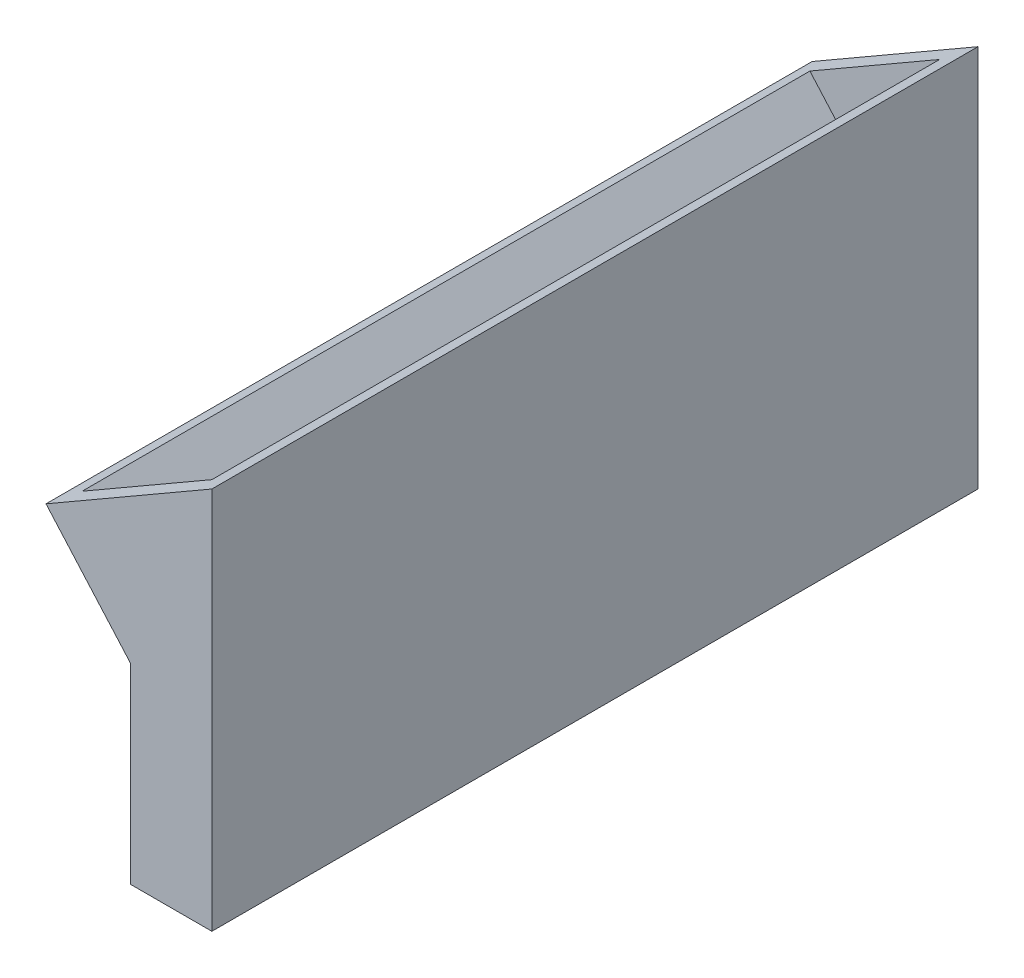
ISO-10303-21;
HEADER;
FILE_DESCRIPTION(('STEP AP214'),'2;1');
FILE_NAME('part.step','',(''),(''),'','','');
FILE_SCHEMA(('AUTOMOTIVE_DESIGN { 1 0 10303 214 1 1 1 1 }'));
ENDSEC;
DATA;
#1=APPLICATION_CONTEXT('core data for automotive mechanical design processes');
#2=APPLICATION_PROTOCOL_DEFINITION('international standard','automotive_design',2000,#1);
#3=PRODUCT_CONTEXT('',#1,'mechanical');
#4=PRODUCT('Part','Part','',(#3));
#5=PRODUCT_RELATED_PRODUCT_CATEGORY('part','',(#4));
#6=PRODUCT_DEFINITION_FORMATION('','',#4);
#7=PRODUCT_DEFINITION_CONTEXT('part definition',#1,'design');
#8=PRODUCT_DEFINITION('design','',#6,#7);
#9=PRODUCT_DEFINITION_SHAPE('','',#8);
#10=(LENGTH_UNIT() NAMED_UNIT(*) SI_UNIT(.MILLI.,.METRE.));
#11=(NAMED_UNIT(*) PLANE_ANGLE_UNIT() SI_UNIT($,.RADIAN.));
#12=(NAMED_UNIT(*) SI_UNIT($,.STERADIAN.) SOLID_ANGLE_UNIT());
#13=UNCERTAINTY_MEASURE_WITH_UNIT(LENGTH_MEASURE(1.E-05),#10,'distance_accuracy_value','');
#14=(GEOMETRIC_REPRESENTATION_CONTEXT(3) GLOBAL_UNCERTAINTY_ASSIGNED_CONTEXT((#13)) GLOBAL_UNIT_ASSIGNED_CONTEXT((#10,
#11,#12)) REPRESENTATION_CONTEXT('',''));
#15=CARTESIAN_POINT('',(0.,0.,0.));
#16=DIRECTION('',(0.,0.,1.));
#17=DIRECTION('',(1.,0.,0.));
#18=AXIS2_PLACEMENT_3D('',#15,#16,#17);
#19=CARTESIAN_POINT('',(-127.5200555821,0.,600.));
#20=DIRECTION('',(0.,1.,0.));
#21=DIRECTION('',(0.,0.,1.));
#22=AXIS2_PLACEMENT_3D('',#19,#20,#21);
#23=PLANE('',#22);
#24=DIRECTION('',(0.,0.,-1.));
#25=VECTOR('',#24,1.);
#26=CARTESIAN_POINT('',(-30.0000000000002,0.,-570.));
#27=LINE('',#26,#25);
#28=CARTESIAN_POINT('',(-30.,0.,570.));
#29=VERTEX_POINT('',#28);
#30=CARTESIAN_POINT('',(-30.,0.,476.30683123147));
#31=VERTEX_POINT('',#30);
#32=EDGE_CURVE('E241',#29,#31,#27,.T.);
#33=ORIENTED_EDGE('',*,*,#32,.T.);
#34=DIRECTION('',(-1.,0.,0.));
#35=VECTOR('',#34,1.);
#36=CARTESIAN_POINT('',(-127.5200555821,0.,476.30683123147));
#37=LINE('',#36,#35);
#38=CARTESIAN_POINT('',(-97.5200555820998,0.,476.30683123147));
#39=VERTEX_POINT('',#38);
#40=EDGE_CURVE('E226',#31,#39,#37,.T.);
#41=ORIENTED_EDGE('',*,*,#40,.T.);
#42=DIRECTION('',(0.,0.,1.));
#43=VECTOR('',#42,1.);
#44=CARTESIAN_POINT('',(-97.5200555820998,0.,-570.));
#45=LINE('',#44,#43);
#46=CARTESIAN_POINT('',(-97.5200555820996,0.,570.));
#47=VERTEX_POINT('',#46);
#48=EDGE_CURVE('E170',#39,#47,#45,.T.);
#49=ORIENTED_EDGE('',*,*,#48,.T.);
#50=DIRECTION('',(1.,0.,0.));
#51=VECTOR('',#50,1.);
#52=CARTESIAN_POINT('',(-97.5200555820996,0.,570.));
#53=LINE('',#52,#51);
#54=EDGE_CURVE('E236',#47,#29,#53,.T.);
#55=ORIENTED_EDGE('',*,*,#54,.T.);
#56=EDGE_LOOP('',(#33,#41,#49,#55));
#57=FACE_BOUND('',#56,.T.);
#58=ADVANCED_FACE('F45',(#57),#23,.T.);
#59=CARTESIAN_POINT('',(-97.5200555820998,0.,-570.));
#60=VERTEX_POINT('',#59);
#61=CARTESIAN_POINT('',(-97.5200555820998,0.,-476.30683123147));
#62=VERTEX_POINT('',#61);
#63=EDGE_CURVE('E232',#60,#62,#45,.T.);
#64=ORIENTED_EDGE('',*,*,#63,.T.);
#65=DIRECTION('',(1.,0.,0.));
#66=VECTOR('',#65,1.);
#67=CARTESIAN_POINT('',(-127.5200555821,0.,-476.30683123147));
#68=LINE('',#67,#66);
#69=CARTESIAN_POINT('',(-30.,0.,-476.30683123147));
#70=VERTEX_POINT('',#69);
#71=EDGE_CURVE('E220',#62,#70,#68,.T.);
#72=ORIENTED_EDGE('',*,*,#71,.T.);
#73=CARTESIAN_POINT('',(-30.0000000000002,0.,-570.));
#74=VERTEX_POINT('',#73);
#75=EDGE_CURVE('E240',#70,#74,#27,.T.);
#76=ORIENTED_EDGE('',*,*,#75,.T.);
#77=DIRECTION('',(-1.,0.,0.));
#78=VECTOR('',#77,1.);
#79=CARTESIAN_POINT('',(-97.5200555820998,0.,-570.));
#80=LINE('',#79,#78);
#81=EDGE_CURVE('E245',#74,#60,#80,.T.);
#82=ORIENTED_EDGE('',*,*,#81,.T.);
#83=EDGE_LOOP('',(#64,#72,#76,#82));
#84=FACE_BOUND('',#83,.T.);
#85=ADVANCED_FACE('F363',(#84),#23,.T.);
#86=CARTESIAN_POINT('',(0.,500.,600.));
#87=DIRECTION('',(0.500000000000004,-0.866025403784436,0.));
#88=DIRECTION('',(0.866025403784436,0.500000000000004,0.));
#89=AXIS2_PLACEMENT_3D('',#86,#87,#88);
#90=PLANE('',#89);
#91=DIRECTION('',(-0.866025403784436,-0.500000000000004,0.));
#92=VECTOR('',#91,1.);
#93=CARTESIAN_POINT('',(0.,500.,-600.));
#94=LINE('',#93,#92);
#95=CARTESIAN_POINT('',(0.,500.,-600.));
#96=VERTEX_POINT('',#95);
#97=CARTESIAN_POINT('',(-259.807621135331,349.999999999999,-600.));
#98=VERTEX_POINT('',#97);
#99=EDGE_CURVE('E301',#96,#98,#94,.T.);
#100=ORIENTED_EDGE('',*,*,#99,.T.);
#101=DIRECTION('',(0.,0.,-1.));
#102=VECTOR('',#101,1.);
#103=CARTESIAN_POINT('',(-259.807621135331,349.999999999999,600.));
#104=LINE('',#103,#102);
#105=CARTESIAN_POINT('',(-259.807621135331,349.999999999999,600.));
#106=VERTEX_POINT('',#105);
#107=EDGE_CURVE('E308',#106,#98,#104,.T.);
#108=ORIENTED_EDGE('',*,*,#107,.F.);
#109=DIRECTION('',(-0.866025403784436,-0.500000000000004,0.));
#110=VECTOR('',#109,1.);
#111=CARTESIAN_POINT('',(0.,500.,600.));
#112=LINE('',#111,#110);
#113=CARTESIAN_POINT('',(0.,500.,600.));
#114=VERTEX_POINT('',#113);
#115=EDGE_CURVE('E290',#114,#106,#112,.T.);
#116=ORIENTED_EDGE('',*,*,#115,.F.);
#117=DIRECTION('',(0.,0.,-1.));
#118=VECTOR('',#117,1.);
#119=CARTESIAN_POINT('',(0.,500.,600.));
#120=LINE('',#119,#118);
#121=EDGE_CURVE('E312',#114,#96,#120,.T.);
#122=ORIENTED_EDGE('',*,*,#121,.T.);
#123=EDGE_LOOP('',(#100,#108,#116,#122));
#124=FACE_BOUND('',#123,.T.);
#125=DIRECTION('',(-0.866025403784436,-0.500000000000004,0.));
#126=VECTOR('',#125,1.);
#127=CARTESIAN_POINT('',(0.,500.,-570.));
#128=LINE('',#127,#126);
#129=CARTESIAN_POINT('',(-30.,482.679491924311,-570.));
#130=VERTEX_POINT('',#129);
#131=CARTESIAN_POINT('',(-233.303075305066,365.302406669851,-570.));
#132=VERTEX_POINT('',#131);
#133=EDGE_CURVE('E252',#130,#132,#128,.T.);
#134=ORIENTED_EDGE('',*,*,#133,.F.);
#135=DIRECTION('',(0.,0.,-1.));
#136=VECTOR('',#135,1.);
#137=CARTESIAN_POINT('',(-30.,482.679491924311,600.));
#138=LINE('',#137,#136);
#139=CARTESIAN_POINT('',(-30.,482.679491924311,570.));
#140=VERTEX_POINT('',#139);
#141=EDGE_CURVE('E276',#140,#130,#138,.T.);
#142=ORIENTED_EDGE('',*,*,#141,.F.);
#143=DIRECTION('',(-0.866025403784436,-0.500000000000004,0.));
#144=VECTOR('',#143,1.);
#145=CARTESIAN_POINT('',(0.,500.,570.));
#146=LINE('',#145,#144);
#147=CARTESIAN_POINT('',(-233.303075305066,365.302406669851,570.));
#148=VERTEX_POINT('',#147);
#149=EDGE_CURVE('E257',#140,#148,#146,.T.);
#150=ORIENTED_EDGE('',*,*,#149,.T.);
#151=DIRECTION('',(0.,0.,-1.));
#152=VECTOR('',#151,1.);
#153=CARTESIAN_POINT('',(-233.303075305066,365.302406669851,600.));
#154=LINE('',#153,#152);
#155=EDGE_CURVE('E273',#148,#132,#154,.T.);
#156=ORIENTED_EDGE('',*,*,#155,.T.);
#157=EDGE_LOOP('',(#134,#142,#150,#156));
#158=FACE_BOUND('',#157,.T.);
#159=ADVANCED_FACE('F372',(#124,#158),#90,.F.);
#160=CARTESIAN_POINT('',(0.,0.,600.));
#161=DIRECTION('',(-1.,0.,0.));
#162=DIRECTION('',(0.,0.,1.));
#163=AXIS2_PLACEMENT_3D('',#160,#161,#162);
#164=PLANE('',#163);
#165=DIRECTION('',(0.,1.,0.));
#166=VECTOR('',#165,1.);
#167=CARTESIAN_POINT('',(0.,0.,-600.));
#168=LINE('',#167,#166);
#169=CARTESIAN_POINT('',(0.,-100.,-600.));
#170=VERTEX_POINT('',#169);
#171=EDGE_CURVE('E188',#170,#96,#168,.T.);
#172=ORIENTED_EDGE('',*,*,#171,.T.);
#173=ORIENTED_EDGE('',*,*,#121,.F.);
#174=DIRECTION('',(0.,1.,0.));
#175=VECTOR('',#174,1.);
#176=CARTESIAN_POINT('',(0.,0.,600.));
#177=LINE('',#176,#175);
#178=CARTESIAN_POINT('',(0.,-100.,600.));
#179=VERTEX_POINT('',#178);
#180=EDGE_CURVE('E182',#179,#114,#177,.T.);
#181=ORIENTED_EDGE('',*,*,#180,.F.);
#182=DIRECTION('',(0.,0.,-1.));
#183=VECTOR('',#182,1.);
#184=CARTESIAN_POINT('',(0.,-100.,-200.));
#185=LINE('',#184,#183);
#186=EDGE_CURVE('E171',#179,#170,#185,.T.);
#187=ORIENTED_EDGE('',*,*,#186,.T.);
#188=EDGE_LOOP('',(#172,#173,#181,#187));
#189=FACE_BOUND('',#188,.T.);
#190=ADVANCED_FACE('F374',(#189),#164,.F.);
#191=CARTESIAN_POINT('',(-259.807621135331,349.999999999999,600.));
#192=DIRECTION('',(0.749999999999993,0.661437827766155,0.));
#193=DIRECTION('',(-0.661437827766155,0.749999999999993,0.));
#194=AXIS2_PLACEMENT_3D('',#191,#192,#193);
#195=PLANE('',#194);
#196=DIRECTION('',(0.661437827766155,-0.749999999999993,0.));
#197=VECTOR('',#196,1.);
#198=CARTESIAN_POINT('',(-259.807621135331,349.999999999999,-600.));
#199=LINE('',#198,#197);
#200=CARTESIAN_POINT('',(-127.5200555821,200.,-600.));
#201=VERTEX_POINT('',#200);
#202=EDGE_CURVE('E183',#98,#201,#199,.T.);
#203=ORIENTED_EDGE('',*,*,#202,.T.);
#204=DIRECTION('',(0.,0.,-1.));
#205=VECTOR('',#204,1.);
#206=CARTESIAN_POINT('',(-127.5200555821,200.,600.));
#207=LINE('',#206,#205);
#208=CARTESIAN_POINT('',(-127.5200555821,200.,600.));
#209=VERTEX_POINT('',#208);
#210=EDGE_CURVE('E178',#209,#201,#207,.T.);
#211=ORIENTED_EDGE('',*,*,#210,.F.);
#212=DIRECTION('',(0.661437827766155,-0.749999999999993,0.));
#213=VECTOR('',#212,1.);
#214=CARTESIAN_POINT('',(-259.807621135331,349.999999999999,600.));
#215=LINE('',#214,#213);
#216=EDGE_CURVE('E293',#106,#209,#215,.T.);
#217=ORIENTED_EDGE('',*,*,#216,.F.);
#218=ORIENTED_EDGE('',*,*,#107,.T.);
#219=EDGE_LOOP('',(#203,#211,#217,#218));
#220=FACE_BOUND('',#219,.T.);
#221=ADVANCED_FACE('F381',(#220),#195,.F.);
#222=CARTESIAN_POINT('',(-127.5200555821,200.,600.));
#223=DIRECTION('',(1.,0.,0.));
#224=DIRECTION('',(0.,1.,0.));
#225=AXIS2_PLACEMENT_3D('',#222,#223,#224);
#226=PLANE('',#225);
#227=DIRECTION('',(0.,-1.,0.));
#228=VECTOR('',#227,1.);
#229=CARTESIAN_POINT('',(-127.5200555821,200.,-600.));
#230=LINE('',#229,#228);
#231=CARTESIAN_POINT('',(-127.5200555821,-100.,-600.));
#232=VERTEX_POINT('',#231);
#233=EDGE_CURVE('E175',#201,#232,#230,.T.);
#234=ORIENTED_EDGE('',*,*,#233,.T.);
#235=DIRECTION('',(0.,0.,-1.));
#236=VECTOR('',#235,1.);
#237=CARTESIAN_POINT('',(-127.5200555821,-100.,-200.));
#238=LINE('',#237,#236);
#239=CARTESIAN_POINT('',(-127.5200555821,-100.,600.));
#240=VERTEX_POINT('',#239);
#241=EDGE_CURVE('E159',#240,#232,#238,.T.);
#242=ORIENTED_EDGE('',*,*,#241,.F.);
#243=DIRECTION('',(0.,-1.,0.));
#244=VECTOR('',#243,1.);
#245=CARTESIAN_POINT('',(-127.5200555821,200.,600.));
#246=LINE('',#245,#244);
#247=EDGE_CURVE('E296',#209,#240,#246,.T.);
#248=ORIENTED_EDGE('',*,*,#247,.F.);
#249=ORIENTED_EDGE('',*,*,#210,.T.);
#250=EDGE_LOOP('',(#234,#242,#248,#249));
#251=FACE_BOUND('',#250,.T.);
#252=ADVANCED_FACE('F176',(#251),#226,.F.);
#253=CARTESIAN_POINT('',(0.,0.,600.));
#254=DIRECTION('',(0.,0.,1.));
#255=DIRECTION('',(1.,0.,0.));
#256=AXIS2_PLACEMENT_3D('',#253,#254,#255);
#257=PLANE('',#256);
#258=ORIENTED_EDGE('',*,*,#247,.T.);
#259=DIRECTION('',(1.,0.,0.));
#260=VECTOR('',#259,1.);
#261=CARTESIAN_POINT('',(-539.830618143866,-100.,600.));
#262=LINE('',#261,#260);
#263=EDGE_CURVE('E166',#240,#179,#262,.T.);
#264=ORIENTED_EDGE('',*,*,#263,.T.);
#265=ORIENTED_EDGE('',*,*,#180,.T.);
#266=ORIENTED_EDGE('',*,*,#115,.T.);
#267=ORIENTED_EDGE('',*,*,#216,.T.);
#268=EDGE_LOOP('',(#258,#264,#265,#266,#267));
#269=FACE_BOUND('',#268,.T.);
#270=ADVANCED_FACE('F404',(#269),#257,.T.);
#271=CARTESIAN_POINT('',(0.,0.,-600.));
#272=DIRECTION('',(0.,0.,1.));
#273=DIRECTION('',(1.,0.,0.));
#274=AXIS2_PLACEMENT_3D('',#271,#272,#273);
#275=PLANE('',#274);
#276=ORIENTED_EDGE('',*,*,#171,.F.);
#277=DIRECTION('',(1.,0.,0.));
#278=VECTOR('',#277,1.);
#279=CARTESIAN_POINT('',(-539.830618143866,-100.,-600.));
#280=LINE('',#279,#278);
#281=EDGE_CURVE('E164',#232,#170,#280,.T.);
#282=ORIENTED_EDGE('',*,*,#281,.F.);
#283=ORIENTED_EDGE('',*,*,#233,.F.);
#284=ORIENTED_EDGE('',*,*,#202,.F.);
#285=ORIENTED_EDGE('',*,*,#99,.F.);
#286=EDGE_LOOP('',(#276,#282,#283,#284,#285));
#287=FACE_BOUND('',#286,.T.);
#288=ADVANCED_FACE('F186',(#287),#275,.F.);
#289=CARTESIAN_POINT('',(-30.,0.,600.));
#290=DIRECTION('',(-1.,0.,0.));
#291=DIRECTION('',(0.,0.,1.));
#292=AXIS2_PLACEMENT_3D('',#289,#290,#291);
#293=PLANE('',#292);
#294=DIRECTION('',(0.,1.,0.));
#295=VECTOR('',#294,1.);
#296=CARTESIAN_POINT('',(-30.,0.,-570.));
#297=LINE('',#296,#295);
#298=EDGE_CURVE('E249',#74,#130,#297,.T.);
#299=ORIENTED_EDGE('',*,*,#298,.F.);
#300=ORIENTED_EDGE('',*,*,#75,.F.);
#301=DIRECTION('',(0.,0.242535625036333,-0.970142500145332));
#302=VECTOR('',#301,1.);
#303=CARTESIAN_POINT('',(-30.,29.10427500436,-592.72393124891));
#304=LINE('',#303,#302);
#305=CARTESIAN_POINT('',(-30.,-62.4301301277304,-226.586310720548));
#306=VERTEX_POINT('',#305);
#307=EDGE_CURVE('E213',#306,#70,#304,.T.);
#308=ORIENTED_EDGE('',*,*,#307,.F.);
#309=CARTESIAN_POINT('',(-30.,-101.235830133544,-236.287735722002));
#310=DIRECTION('',(-1.,0.,0.));
#311=DIRECTION('',(0.,0.,1.));
#312=AXIS2_PLACEMENT_3D('',#309,#310,#311);
#313=CIRCLE('',#312,40.);
#314=CARTESIAN_POINT('',(-30.,-100.,-196.30683123147));
#315=VERTEX_POINT('',#314);
#316=EDGE_CURVE('E322',#306,#315,#313,.F.);
#317=ORIENTED_EDGE('',*,*,#316,.T.);
#318=DIRECTION('',(0.,0.,-1.));
#319=VECTOR('',#318,1.);
#320=CARTESIAN_POINT('',(-30.,-100.,-196.30683123147));
#321=LINE('',#320,#319);
#322=CARTESIAN_POINT('',(-30.,-100.,196.30683123147));
#323=VERTEX_POINT('',#322);
#324=EDGE_CURVE('E192',#323,#315,#321,.T.);
#325=ORIENTED_EDGE('',*,*,#324,.F.);
#326=CARTESIAN_POINT('',(-30.,-101.235830133544,236.287735722002));
#327=DIRECTION('',(-1.,0.,0.));
#328=DIRECTION('',(0.,0.,1.));
#329=AXIS2_PLACEMENT_3D('',#326,#327,#328);
#330=CIRCLE('',#329,40.);
#331=CARTESIAN_POINT('',(-30.,-62.4301301277304,226.586310720549));
#332=VERTEX_POINT('',#331);
#333=EDGE_CURVE('E54',#323,#332,#330,.F.);
#334=ORIENTED_EDGE('',*,*,#333,.T.);
#335=DIRECTION('',(0.,-0.242535625036333,-0.970142500145332));
#336=VECTOR('',#335,1.);
#337=CARTESIAN_POINT('',(-30.,-70.8957249956401,192.72393124891));
#338=LINE('',#337,#336);
#339=EDGE_CURVE('E210',#31,#332,#338,.T.);
#340=ORIENTED_EDGE('',*,*,#339,.F.);
#341=ORIENTED_EDGE('',*,*,#32,.F.);
#342=DIRECTION('',(0.,1.,0.));
#343=VECTOR('',#342,1.);
#344=CARTESIAN_POINT('',(-30.,0.,570.));
#345=LINE('',#344,#343);
#346=EDGE_CURVE('E253',#29,#140,#345,.T.);
#347=ORIENTED_EDGE('',*,*,#346,.T.);
#348=ORIENTED_EDGE('',*,*,#141,.T.);
#349=EDGE_LOOP('',(#299,#300,#308,#317,#325,#334,#340,#341,#347,#348));
#350=FACE_BOUND('',#349,.T.);
#351=ADVANCED_FACE('F344',(#350),#293,.T.);
#352=CARTESIAN_POINT('',(-237.307621135331,369.843134832983,600.));
#353=DIRECTION('',(0.749999999999993,0.661437827766155,0.));
#354=DIRECTION('',(-0.661437827766155,0.749999999999993,0.));
#355=AXIS2_PLACEMENT_3D('',#352,#353,#354);
#356=PLANE('',#355);
#357=DIRECTION('',(0.661437827766155,-0.749999999999993,0.));
#358=VECTOR('',#357,1.);
#359=CARTESIAN_POINT('',(-237.307621135331,369.843134832983,-570.));
#360=LINE('',#359,#358);
#361=CARTESIAN_POINT('',(-97.5200555820998,211.338934190277,-570.));
#362=VERTEX_POINT('',#361);
#363=EDGE_CURVE('E267',#132,#362,#360,.T.);
#364=ORIENTED_EDGE('',*,*,#363,.F.);
#365=ORIENTED_EDGE('',*,*,#155,.F.);
#366=DIRECTION('',(0.661437827766155,-0.749999999999993,0.));
#367=VECTOR('',#366,1.);
#368=CARTESIAN_POINT('',(-237.307621135331,369.843134832983,570.));
#369=LINE('',#368,#367);
#370=CARTESIAN_POINT('',(-97.5200555820998,211.338934190277,570.));
#371=VERTEX_POINT('',#370);
#372=EDGE_CURVE('E259',#148,#371,#369,.T.);
#373=ORIENTED_EDGE('',*,*,#372,.T.);
#374=DIRECTION('',(0.,0.,-1.));
#375=VECTOR('',#374,1.);
#376=CARTESIAN_POINT('',(-97.5200555820998,211.338934190277,600.));
#377=LINE('',#376,#375);
#378=EDGE_CURVE('E266',#371,#362,#377,.T.);
#379=ORIENTED_EDGE('',*,*,#378,.T.);
#380=EDGE_LOOP('',(#364,#365,#373,#379));
#381=FACE_BOUND('',#380,.T.);
#382=ADVANCED_FACE('F370',(#381),#356,.T.);
#383=CARTESIAN_POINT('',(-97.5200555820998,200.,600.));
#384=DIRECTION('',(1.,0.,0.));
#385=DIRECTION('',(0.,1.,0.));
#386=AXIS2_PLACEMENT_3D('',#383,#384,#385);
#387=PLANE('',#386);
#388=DIRECTION('',(0.,-1.,0.));
#389=VECTOR('',#388,1.);
#390=CARTESIAN_POINT('',(-97.5200555820998,200.,-570.));
#391=LINE('',#390,#389);
#392=EDGE_CURVE('E258',#362,#60,#391,.T.);
#393=ORIENTED_EDGE('',*,*,#392,.F.);
#394=ORIENTED_EDGE('',*,*,#378,.F.);
#395=DIRECTION('',(0.,-1.,0.));
#396=VECTOR('',#395,1.);
#397=CARTESIAN_POINT('',(-97.5200555820998,200.,570.));
#398=LINE('',#397,#396);
#399=EDGE_CURVE('E262',#371,#47,#398,.T.);
#400=ORIENTED_EDGE('',*,*,#399,.T.);
#401=ORIENTED_EDGE('',*,*,#48,.F.);
#402=DIRECTION('',(0.,-0.242535625036333,-0.970142500145332));
#403=VECTOR('',#402,1.);
#404=CARTESIAN_POINT('',(-97.5200555820998,40.8689808867129,639.782754778322));
#405=LINE('',#404,#403);
#406=CARTESIAN_POINT('',(-97.5200555820998,-62.4301301277305,226.586310720549));
#407=VERTEX_POINT('',#406);
#408=EDGE_CURVE('E216',#39,#407,#405,.T.);
#409=ORIENTED_EDGE('',*,*,#408,.T.);
#410=CARTESIAN_POINT('',(-97.5200555820998,-101.235830133544,236.287735722002));
#411=DIRECTION('',(1.,0.,0.));
#412=DIRECTION('',(0.,1.,0.));
#413=AXIS2_PLACEMENT_3D('',#410,#411,#412);
#414=CIRCLE('',#413,40.);
#415=CARTESIAN_POINT('',(-97.5200555820998,-100.,196.30683123147));
#416=VERTEX_POINT('',#415);
#417=EDGE_CURVE('E11',#407,#416,#414,.F.);
#418=ORIENTED_EDGE('',*,*,#417,.T.);
#419=DIRECTION('',(0.,0.,1.));
#420=VECTOR('',#419,1.);
#421=CARTESIAN_POINT('',(-97.5200555820999,-100.,-196.30683123147));
#422=LINE('',#421,#420);
#423=CARTESIAN_POINT('',(-97.5200555820999,-100.,-196.30683123147));
#424=VERTEX_POINT('',#423);
#425=EDGE_CURVE('E202',#424,#416,#422,.T.);
#426=ORIENTED_EDGE('',*,*,#425,.F.);
#427=CARTESIAN_POINT('',(-97.5200555820998,-101.235830133544,-236.287735722002));
#428=DIRECTION('',(1.,0.,0.));
#429=DIRECTION('',(0.,1.,0.));
#430=AXIS2_PLACEMENT_3D('',#427,#428,#429);
#431=CIRCLE('',#430,40.);
#432=CARTESIAN_POINT('',(-97.5200555820998,-62.4301301277303,-226.586310720549));
#433=VERTEX_POINT('',#432);
#434=EDGE_CURVE('E325',#424,#433,#431,.F.);
#435=ORIENTED_EDGE('',*,*,#434,.T.);
#436=DIRECTION('',(0.,0.242535625036333,-0.970142500145332));
#437=VECTOR('',#436,1.);
#438=CARTESIAN_POINT('',(-97.5200555820998,-241.483960289758,489.629009927561));
#439=LINE('',#438,#437);
#440=EDGE_CURVE('E217',#433,#62,#439,.T.);
#441=ORIENTED_EDGE('',*,*,#440,.T.);
#442=ORIENTED_EDGE('',*,*,#63,.F.);
#443=EDGE_LOOP('',(#393,#394,#400,#401,#409,#418,#426,#435,#441,#442));
#444=FACE_BOUND('',#443,.T.);
#445=ADVANCED_FACE('F337',(#444),#387,.T.);
#446=CARTESIAN_POINT('',(0.,0.,570.));
#447=DIRECTION('',(0.,0.,1.));
#448=DIRECTION('',(1.,0.,0.));
#449=AXIS2_PLACEMENT_3D('',#446,#447,#448);
#450=PLANE('',#449);
#451=ORIENTED_EDGE('',*,*,#346,.F.);
#452=ORIENTED_EDGE('',*,*,#54,.F.);
#453=ORIENTED_EDGE('',*,*,#399,.F.);
#454=ORIENTED_EDGE('',*,*,#372,.F.);
#455=ORIENTED_EDGE('',*,*,#149,.F.);
#456=EDGE_LOOP('',(#451,#452,#453,#454,#455));
#457=FACE_BOUND('',#456,.T.);
#458=ADVANCED_FACE('F340',(#457),#450,.F.);
#459=CARTESIAN_POINT('',(0.,0.,-570.));
#460=DIRECTION('',(0.,0.,1.));
#461=DIRECTION('',(1.,0.,0.));
#462=AXIS2_PLACEMENT_3D('',#459,#460,#461);
#463=PLANE('',#462);
#464=ORIENTED_EDGE('',*,*,#392,.T.);
#465=ORIENTED_EDGE('',*,*,#81,.F.);
#466=ORIENTED_EDGE('',*,*,#298,.T.);
#467=ORIENTED_EDGE('',*,*,#133,.T.);
#468=ORIENTED_EDGE('',*,*,#363,.T.);
#469=EDGE_LOOP('',(#464,#465,#466,#467,#468));
#470=FACE_BOUND('',#469,.T.);
#471=ADVANCED_FACE('F366',(#470),#463,.T.);
#472=CARTESIAN_POINT('',(-127.5200555821,-100.,-200.));
#473=DIRECTION('',(0.,-1.,0.));
#474=DIRECTION('',(0.,0.,-1.));
#475=AXIS2_PLACEMENT_3D('',#472,#473,#474);
#476=PLANE('',#475);
#477=ORIENTED_EDGE('',*,*,#324,.T.);
#478=DIRECTION('',(-1.,0.,0.));
#479=VECTOR('',#478,1.);
#480=CARTESIAN_POINT('',(-30.,-100.,-196.30683123147));
#481=LINE('',#480,#479);
#482=EDGE_CURVE('E198',#315,#424,#481,.T.);
#483=ORIENTED_EDGE('',*,*,#482,.T.);
#484=ORIENTED_EDGE('',*,*,#425,.T.);
#485=DIRECTION('',(1.,0.,0.));
#486=VECTOR('',#485,1.);
#487=CARTESIAN_POINT('',(-30.,-100.,196.30683123147));
#488=LINE('',#487,#486);
#489=EDGE_CURVE('E206',#416,#323,#488,.T.);
#490=ORIENTED_EDGE('',*,*,#489,.T.);
#491=EDGE_LOOP('',(#477,#483,#484,#490));
#492=FACE_BOUND('',#491,.T.);
#493=ORIENTED_EDGE('',*,*,#186,.F.);
#494=ORIENTED_EDGE('',*,*,#263,.F.);
#495=ORIENTED_EDGE('',*,*,#241,.T.);
#496=ORIENTED_EDGE('',*,*,#281,.T.);
#497=EDGE_LOOP('',(#493,#494,#495,#496));
#498=FACE_BOUND('',#497,.T.);
#499=ADVANCED_FACE('F162',(#492,#498),#476,.T.);
#500=CARTESIAN_POINT('',(-127.5200555821,-70.8957249956401,192.72393124891));
#501=DIRECTION('',(0.,-0.970142500145332,0.242535625036333));
#502=DIRECTION('',(0.,-0.242535625036333,-0.970142500145332));
#503=AXIS2_PLACEMENT_3D('',#500,#501,#502);
#504=PLANE('',#503);
#505=ORIENTED_EDGE('',*,*,#339,.T.);
#506=DIRECTION('',(1.,0.,0.));
#507=VECTOR('',#506,1.);
#508=CARTESIAN_POINT('',(-127.5200555821,-62.4301301277304,226.586310720549));
#509=LINE('',#508,#507);
#510=EDGE_CURVE('E61',#332,#407,#509,.F.);
#511=ORIENTED_EDGE('',*,*,#510,.T.);
#512=ORIENTED_EDGE('',*,*,#408,.F.);
#513=ORIENTED_EDGE('',*,*,#40,.F.);
#514=EDGE_LOOP('',(#505,#511,#512,#513));
#515=FACE_BOUND('',#514,.T.);
#516=ADVANCED_FACE('F345',(#515),#504,.F.);
#517=CARTESIAN_POINT('',(-127.5200555821,29.10427500436,-592.72393124891));
#518=DIRECTION('',(0.,-0.970142500145332,-0.242535625036333));
#519=DIRECTION('',(0.,0.242535625036333,-0.970142500145332));
#520=AXIS2_PLACEMENT_3D('',#517,#518,#519);
#521=PLANE('',#520);
#522=ORIENTED_EDGE('',*,*,#440,.F.);
#523=DIRECTION('',(-1.,0.,0.));
#524=VECTOR('',#523,1.);
#525=CARTESIAN_POINT('',(-127.5200555821,-62.4301301277303,-226.586310720549));
#526=LINE('',#525,#524);
#527=EDGE_CURVE('E316',#433,#306,#526,.F.);
#528=ORIENTED_EDGE('',*,*,#527,.T.);
#529=ORIENTED_EDGE('',*,*,#307,.T.);
#530=ORIENTED_EDGE('',*,*,#71,.F.);
#531=EDGE_LOOP('',(#522,#528,#529,#530));
#532=FACE_BOUND('',#531,.T.);
#533=ADVANCED_FACE('F359',(#532),#521,.F.);
#534=CARTESIAN_POINT('',(-30.,-101.235830133544,-236.287735722002));
#535=DIRECTION('',(-1.,0.,0.));
#536=DIRECTION('',(0.,0.,1.));
#537=AXIS2_PLACEMENT_3D('',#534,#535,#536);
#538=CYLINDRICAL_SURFACE('',#537,40.);
#539=ORIENTED_EDGE('',*,*,#434,.F.);
#540=ORIENTED_EDGE('',*,*,#482,.F.);
#541=ORIENTED_EDGE('',*,*,#316,.F.);
#542=ORIENTED_EDGE('',*,*,#527,.F.);
#543=EDGE_LOOP('',(#539,#540,#541,#542));
#544=FACE_BOUND('',#543,.T.);
#545=ADVANCED_FACE('F354',(#544),#538,.T.);
#546=CARTESIAN_POINT('',(-30.,-101.235830133544,236.287735722002));
#547=DIRECTION('',(1.,0.,0.));
#548=DIRECTION('',(0.,0.,-1.));
#549=AXIS2_PLACEMENT_3D('',#546,#547,#548);
#550=CYLINDRICAL_SURFACE('',#549,40.);
#551=ORIENTED_EDGE('',*,*,#417,.F.);
#552=ORIENTED_EDGE('',*,*,#510,.F.);
#553=ORIENTED_EDGE('',*,*,#333,.F.);
#554=ORIENTED_EDGE('',*,*,#489,.F.);
#555=EDGE_LOOP('',(#551,#552,#553,#554));
#556=FACE_BOUND('',#555,.T.);
#557=ADVANCED_FACE('F47',(#556),#550,.T.);
#558=CLOSED_SHELL('',(#58,#85,#159,#190,#221,#252,#270,#288,#351,#382,#445,#458,#471,#499,#516,
#533,#545,#557));
#559=MANIFOLD_SOLID_BREP('B2',#558);
#560=ADVANCED_BREP_SHAPE_REPRESENTATION('',(#18,#559),#14);
#561=SHAPE_DEFINITION_REPRESENTATION(#9,#560);
ENDSEC;
END-ISO-10303-21;
